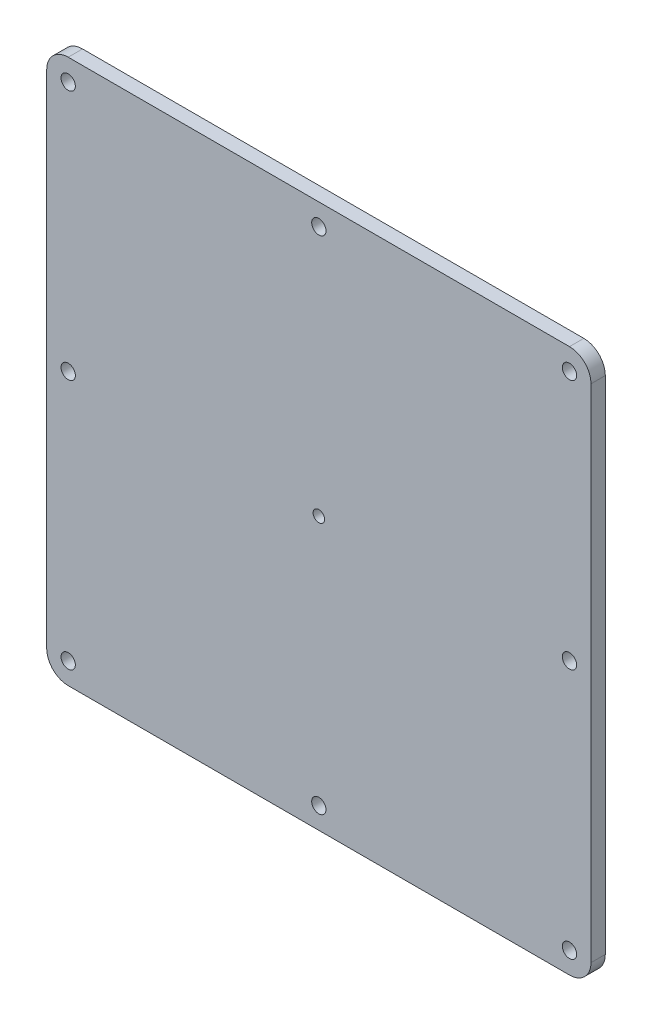
ISO-10303-21;
HEADER;
FILE_DESCRIPTION(('STEP AP214'),'2;1');
FILE_NAME('part.step','',(''),(''),'','','');
FILE_SCHEMA(('AUTOMOTIVE_DESIGN { 1 0 10303 214 1 1 1 1 }'));
ENDSEC;
DATA;
#1=APPLICATION_CONTEXT('core data for automotive mechanical design processes');
#2=APPLICATION_PROTOCOL_DEFINITION('international standard','automotive_design',2000,#1);
#3=PRODUCT_CONTEXT('',#1,'mechanical');
#4=PRODUCT('Part','Part','',(#3));
#5=PRODUCT_RELATED_PRODUCT_CATEGORY('part','',(#4));
#6=PRODUCT_DEFINITION_FORMATION('','',#4);
#7=PRODUCT_DEFINITION_CONTEXT('part definition',#1,'design');
#8=PRODUCT_DEFINITION('design','',#6,#7);
#9=PRODUCT_DEFINITION_SHAPE('','',#8);
#10=(LENGTH_UNIT() NAMED_UNIT(*) SI_UNIT(.MILLI.,.METRE.));
#11=(NAMED_UNIT(*) PLANE_ANGLE_UNIT() SI_UNIT($,.RADIAN.));
#12=(NAMED_UNIT(*) SI_UNIT($,.STERADIAN.) SOLID_ANGLE_UNIT());
#13=UNCERTAINTY_MEASURE_WITH_UNIT(LENGTH_MEASURE(1.E-05),#10,'distance_accuracy_value','');
#14=(GEOMETRIC_REPRESENTATION_CONTEXT(3) GLOBAL_UNCERTAINTY_ASSIGNED_CONTEXT((#13)) GLOBAL_UNIT_ASSIGNED_CONTEXT((#10,
#11,#12)) REPRESENTATION_CONTEXT('',''));
#15=CARTESIAN_POINT('',(0.,0.,0.));
#16=DIRECTION('',(0.,0.,1.));
#17=DIRECTION('',(1.,0.,0.));
#18=AXIS2_PLACEMENT_3D('',#15,#16,#17);
#19=CARTESIAN_POINT('',(-175.,-175.,10.));
#20=DIRECTION('',(0.,0.,1.));
#21=DIRECTION('',(1.,0.,0.));
#22=AXIS2_PLACEMENT_3D('',#19,#20,#21);
#23=PLANE('',#22);
#24=CARTESIAN_POINT('',(0.,-175.,10.));
#25=DIRECTION('',(0.,0.,1.));
#26=DIRECTION('',(1.,0.,0.));
#27=AXIS2_PLACEMENT_3D('',#24,#25,#26);
#28=CIRCLE('',#27,5.);
#29=CARTESIAN_POINT('',(5.,-175.,10.));
#30=VERTEX_POINT('',#29);
#31=EDGE_CURVE('E218',#30,#30,#28,.T.);
#32=ORIENTED_EDGE('',*,*,#31,.F.);
#33=EDGE_LOOP('',(#32));
#34=FACE_BOUND('',#33,.T.);
#35=CARTESIAN_POINT('',(0.,0.,10.));
#36=DIRECTION('',(0.,0.,1.));
#37=DIRECTION('',(1.,0.,0.));
#38=AXIS2_PLACEMENT_3D('',#35,#36,#37);
#39=CIRCLE('',#38,4.);
#40=CARTESIAN_POINT('',(3.99999999999997,0.,10.));
#41=VERTEX_POINT('',#40);
#42=EDGE_CURVE('E206',#41,#41,#39,.T.);
#43=ORIENTED_EDGE('',*,*,#42,.F.);
#44=EDGE_LOOP('',(#43));
#45=FACE_BOUND('',#44,.T.);
#46=CARTESIAN_POINT('',(175.,0.,10.));
#47=DIRECTION('',(0.,0.,1.));
#48=DIRECTION('',(1.,0.,0.));
#49=AXIS2_PLACEMENT_3D('',#46,#47,#48);
#50=CIRCLE('',#49,5.00000000000002);
#51=CARTESIAN_POINT('',(180.,0.,10.));
#52=VERTEX_POINT('',#51);
#53=EDGE_CURVE('E194',#52,#52,#50,.T.);
#54=ORIENTED_EDGE('',*,*,#53,.F.);
#55=EDGE_LOOP('',(#54));
#56=FACE_BOUND('',#55,.T.);
#57=CARTESIAN_POINT('',(0.,175.,10.));
#58=DIRECTION('',(0.,0.,1.));
#59=DIRECTION('',(1.,0.,0.));
#60=AXIS2_PLACEMENT_3D('',#57,#58,#59);
#61=CIRCLE('',#60,5.00000000000001);
#62=CARTESIAN_POINT('',(5.00000000000001,175.,10.));
#63=VERTEX_POINT('',#62);
#64=EDGE_CURVE('E182',#63,#63,#61,.T.);
#65=ORIENTED_EDGE('',*,*,#64,.F.);
#66=EDGE_LOOP('',(#65));
#67=FACE_BOUND('',#66,.T.);
#68=CARTESIAN_POINT('',(-175.,-175.,10.));
#69=DIRECTION('',(0.,0.,1.));
#70=DIRECTION('',(1.,0.,0.));
#71=AXIS2_PLACEMENT_3D('',#68,#69,#70);
#72=CIRCLE('',#71,15.);
#73=CARTESIAN_POINT('',(-190.,-175.,10.));
#74=VERTEX_POINT('',#73);
#75=CARTESIAN_POINT('',(-175.,-190.,10.));
#76=VERTEX_POINT('',#75);
#77=EDGE_CURVE('E145',#74,#76,#72,.T.);
#78=ORIENTED_EDGE('',*,*,#77,.T.);
#79=DIRECTION('',(1.,0.,0.));
#80=VECTOR('',#79,1.);
#81=CARTESIAN_POINT('',(-175.,-190.,10.));
#82=LINE('',#81,#80);
#83=CARTESIAN_POINT('',(175.,-190.,10.));
#84=VERTEX_POINT('',#83);
#85=EDGE_CURVE('E93',#76,#84,#82,.T.);
#86=ORIENTED_EDGE('',*,*,#85,.T.);
#87=CARTESIAN_POINT('',(175.,-175.,10.));
#88=DIRECTION('',(0.,0.,1.));
#89=DIRECTION('',(1.,0.,0.));
#90=AXIS2_PLACEMENT_3D('',#87,#88,#89);
#91=CIRCLE('',#90,15.);
#92=CARTESIAN_POINT('',(190.,-175.,10.));
#93=VERTEX_POINT('',#92);
#94=EDGE_CURVE('E160',#84,#93,#91,.T.);
#95=ORIENTED_EDGE('',*,*,#94,.T.);
#96=DIRECTION('',(0.,1.,0.));
#97=VECTOR('',#96,1.);
#98=CARTESIAN_POINT('',(190.,175.,10.));
#99=LINE('',#98,#97);
#100=CARTESIAN_POINT('',(190.,175.,10.));
#101=VERTEX_POINT('',#100);
#102=EDGE_CURVE('E173',#93,#101,#99,.T.);
#103=ORIENTED_EDGE('',*,*,#102,.T.);
#104=CARTESIAN_POINT('',(175.,175.,10.));
#105=DIRECTION('',(0.,0.,1.));
#106=DIRECTION('',(-1.,0.,0.));
#107=AXIS2_PLACEMENT_3D('',#104,#105,#106);
#108=CIRCLE('',#107,15.);
#109=CARTESIAN_POINT('',(175.,190.,10.));
#110=VERTEX_POINT('',#109);
#111=EDGE_CURVE('E112',#101,#110,#108,.T.);
#112=ORIENTED_EDGE('',*,*,#111,.T.);
#113=DIRECTION('',(-1.,0.,0.));
#114=VECTOR('',#113,1.);
#115=CARTESIAN_POINT('',(-175.,190.,10.));
#116=LINE('',#115,#114);
#117=CARTESIAN_POINT('',(-175.,190.,10.));
#118=VERTEX_POINT('',#117);
#119=EDGE_CURVE('E106',#110,#118,#116,.T.);
#120=ORIENTED_EDGE('',*,*,#119,.T.);
#121=CARTESIAN_POINT('',(-175.,175.,10.));
#122=DIRECTION('',(0.,0.,1.));
#123=DIRECTION('',(1.,0.,0.));
#124=AXIS2_PLACEMENT_3D('',#121,#122,#123);
#125=CIRCLE('',#124,15.0000000000001);
#126=CARTESIAN_POINT('',(-190.,175.,10.));
#127=VERTEX_POINT('',#126);
#128=EDGE_CURVE('E110',#118,#127,#125,.T.);
#129=ORIENTED_EDGE('',*,*,#128,.T.);
#130=DIRECTION('',(0.,-1.,0.));
#131=VECTOR('',#130,1.);
#132=CARTESIAN_POINT('',(-190.,175.,10.));
#133=LINE('',#132,#131);
#134=EDGE_CURVE('E50',#127,#74,#133,.T.);
#135=ORIENTED_EDGE('',*,*,#134,.T.);
#136=EDGE_LOOP('',(#78,#86,#95,#103,#112,#120,#129,#135));
#137=FACE_BOUND('',#136,.T.);
#138=CARTESIAN_POINT('',(-175.,175.,10.));
#139=DIRECTION('',(0.,0.,1.));
#140=DIRECTION('',(1.,0.,0.));
#141=AXIS2_PLACEMENT_3D('',#138,#139,#140);
#142=CIRCLE('',#141,4.99999999999999);
#143=CARTESIAN_POINT('',(-170.,175.,10.));
#144=VERTEX_POINT('',#143);
#145=EDGE_CURVE('E134',#144,#144,#142,.T.);
#146=ORIENTED_EDGE('',*,*,#145,.F.);
#147=EDGE_LOOP('',(#146));
#148=FACE_BOUND('',#147,.T.);
#149=CARTESIAN_POINT('',(175.,175.,10.));
#150=DIRECTION('',(0.,0.,1.));
#151=DIRECTION('',(1.,0.,0.));
#152=AXIS2_PLACEMENT_3D('',#149,#150,#151);
#153=CIRCLE('',#152,4.99999999999999);
#154=CARTESIAN_POINT('',(180.,175.,10.));
#155=VERTEX_POINT('',#154);
#156=EDGE_CURVE('E188',#155,#155,#153,.T.);
#157=ORIENTED_EDGE('',*,*,#156,.F.);
#158=EDGE_LOOP('',(#157));
#159=FACE_BOUND('',#158,.T.);
#160=CARTESIAN_POINT('',(-175.,0.,10.));
#161=DIRECTION('',(0.,0.,1.));
#162=DIRECTION('',(1.,0.,0.));
#163=AXIS2_PLACEMENT_3D('',#160,#161,#162);
#164=CIRCLE('',#163,5.00000000000002);
#165=CARTESIAN_POINT('',(-170.,0.,10.));
#166=VERTEX_POINT('',#165);
#167=EDGE_CURVE('E200',#166,#166,#164,.T.);
#168=ORIENTED_EDGE('',*,*,#167,.F.);
#169=EDGE_LOOP('',(#168));
#170=FACE_BOUND('',#169,.T.);
#171=CARTESIAN_POINT('',(-175.,-175.,10.));
#172=DIRECTION('',(0.,0.,1.));
#173=DIRECTION('',(1.,0.,0.));
#174=AXIS2_PLACEMENT_3D('',#171,#172,#173);
#175=CIRCLE('',#174,4.99999999999999);
#176=CARTESIAN_POINT('',(-170.,-175.,10.));
#177=VERTEX_POINT('',#176);
#178=EDGE_CURVE('E212',#177,#177,#175,.T.);
#179=ORIENTED_EDGE('',*,*,#178,.F.);
#180=EDGE_LOOP('',(#179));
#181=FACE_BOUND('',#180,.T.);
#182=CARTESIAN_POINT('',(175.,-175.,10.));
#183=DIRECTION('',(0.,0.,1.));
#184=DIRECTION('',(1.,0.,0.));
#185=AXIS2_PLACEMENT_3D('',#182,#183,#184);
#186=CIRCLE('',#185,4.99999999999999);
#187=CARTESIAN_POINT('',(180.,-175.,10.));
#188=VERTEX_POINT('',#187);
#189=EDGE_CURVE('E224',#188,#188,#186,.T.);
#190=ORIENTED_EDGE('',*,*,#189,.F.);
#191=EDGE_LOOP('',(#190));
#192=FACE_BOUND('',#191,.T.);
#193=ADVANCED_FACE('F33',(#34,#45,#56,#67,#137,#148,#159,#170,#181,#192),#23,.T.);
#194=CARTESIAN_POINT('',(-175.,-175.,0.));
#195=DIRECTION('',(0.,0.,1.));
#196=DIRECTION('',(1.,0.,0.));
#197=AXIS2_PLACEMENT_3D('',#194,#195,#196);
#198=PLANE('',#197);
#199=CARTESIAN_POINT('',(-175.,-175.,0.));
#200=DIRECTION('',(0.,0.,1.));
#201=DIRECTION('',(1.,0.,0.));
#202=AXIS2_PLACEMENT_3D('',#199,#200,#201);
#203=CIRCLE('',#202,15.);
#204=CARTESIAN_POINT('',(-190.,-175.,0.));
#205=VERTEX_POINT('',#204);
#206=CARTESIAN_POINT('',(-175.,-190.,0.));
#207=VERTEX_POINT('',#206);
#208=EDGE_CURVE('E130',#205,#207,#203,.T.);
#209=ORIENTED_EDGE('',*,*,#208,.F.);
#210=DIRECTION('',(0.,-1.,0.));
#211=VECTOR('',#210,1.);
#212=CARTESIAN_POINT('',(-190.,175.,0.));
#213=LINE('',#212,#211);
#214=CARTESIAN_POINT('',(-190.,175.,0.));
#215=VERTEX_POINT('',#214);
#216=EDGE_CURVE('E85',#215,#205,#213,.T.);
#217=ORIENTED_EDGE('',*,*,#216,.F.);
#218=CARTESIAN_POINT('',(-175.,175.,0.));
#219=DIRECTION('',(0.,0.,1.));
#220=DIRECTION('',(1.,0.,0.));
#221=AXIS2_PLACEMENT_3D('',#218,#219,#220);
#222=CIRCLE('',#221,15.0000000000001);
#223=CARTESIAN_POINT('',(-175.,190.,0.));
#224=VERTEX_POINT('',#223);
#225=EDGE_CURVE('E79',#224,#215,#222,.T.);
#226=ORIENTED_EDGE('',*,*,#225,.F.);
#227=DIRECTION('',(-1.,0.,0.));
#228=VECTOR('',#227,1.);
#229=CARTESIAN_POINT('',(-175.,190.,0.));
#230=LINE('',#229,#228);
#231=CARTESIAN_POINT('',(175.,190.,0.));
#232=VERTEX_POINT('',#231);
#233=EDGE_CURVE('E120',#232,#224,#230,.T.);
#234=ORIENTED_EDGE('',*,*,#233,.F.);
#235=CARTESIAN_POINT('',(175.,175.,0.));
#236=DIRECTION('',(0.,0.,1.));
#237=DIRECTION('',(-1.,0.,0.));
#238=AXIS2_PLACEMENT_3D('',#235,#236,#237);
#239=CIRCLE('',#238,15.);
#240=CARTESIAN_POINT('',(190.,175.,0.));
#241=VERTEX_POINT('',#240);
#242=EDGE_CURVE('E140',#241,#232,#239,.T.);
#243=ORIENTED_EDGE('',*,*,#242,.F.);
#244=DIRECTION('',(0.,1.,0.));
#245=VECTOR('',#244,1.);
#246=CARTESIAN_POINT('',(190.,175.,0.));
#247=LINE('',#246,#245);
#248=CARTESIAN_POINT('',(190.,-175.,0.));
#249=VERTEX_POINT('',#248);
#250=EDGE_CURVE('E138',#249,#241,#247,.T.);
#251=ORIENTED_EDGE('',*,*,#250,.F.);
#252=CARTESIAN_POINT('',(175.,-175.,0.));
#253=DIRECTION('',(0.,0.,1.));
#254=DIRECTION('',(1.,0.,0.));
#255=AXIS2_PLACEMENT_3D('',#252,#253,#254);
#256=CIRCLE('',#255,15.);
#257=CARTESIAN_POINT('',(175.,-190.,0.));
#258=VERTEX_POINT('',#257);
#259=EDGE_CURVE('E136',#258,#249,#256,.T.);
#260=ORIENTED_EDGE('',*,*,#259,.F.);
#261=DIRECTION('',(1.,0.,0.));
#262=VECTOR('',#261,1.);
#263=CARTESIAN_POINT('',(-175.,-190.,0.));
#264=LINE('',#263,#262);
#265=EDGE_CURVE('E133',#207,#258,#264,.T.);
#266=ORIENTED_EDGE('',*,*,#265,.F.);
#267=EDGE_LOOP('',(#209,#217,#226,#234,#243,#251,#260,#266));
#268=FACE_BOUND('',#267,.T.);
#269=CARTESIAN_POINT('',(-175.,175.,0.));
#270=DIRECTION('',(0.,0.,1.));
#271=DIRECTION('',(1.,0.,0.));
#272=AXIS2_PLACEMENT_3D('',#269,#270,#271);
#273=CIRCLE('',#272,4.99999999999999);
#274=CARTESIAN_POINT('',(-170.,175.,0.));
#275=VERTEX_POINT('',#274);
#276=EDGE_CURVE('E179',#275,#275,#273,.T.);
#277=ORIENTED_EDGE('',*,*,#276,.T.);
#278=EDGE_LOOP('',(#277));
#279=FACE_BOUND('',#278,.T.);
#280=CARTESIAN_POINT('',(0.,175.,0.));
#281=DIRECTION('',(0.,0.,1.));
#282=DIRECTION('',(1.,0.,0.));
#283=AXIS2_PLACEMENT_3D('',#280,#281,#282);
#284=CIRCLE('',#283,5.00000000000001);
#285=CARTESIAN_POINT('',(5.00000000000001,175.,0.));
#286=VERTEX_POINT('',#285);
#287=EDGE_CURVE('E185',#286,#286,#284,.T.);
#288=ORIENTED_EDGE('',*,*,#287,.T.);
#289=EDGE_LOOP('',(#288));
#290=FACE_BOUND('',#289,.T.);
#291=CARTESIAN_POINT('',(175.,175.,0.));
#292=DIRECTION('',(0.,0.,1.));
#293=DIRECTION('',(1.,0.,0.));
#294=AXIS2_PLACEMENT_3D('',#291,#292,#293);
#295=CIRCLE('',#294,4.99999999999999);
#296=CARTESIAN_POINT('',(180.,175.,0.));
#297=VERTEX_POINT('',#296);
#298=EDGE_CURVE('E191',#297,#297,#295,.T.);
#299=ORIENTED_EDGE('',*,*,#298,.T.);
#300=EDGE_LOOP('',(#299));
#301=FACE_BOUND('',#300,.T.);
#302=CARTESIAN_POINT('',(175.,0.,0.));
#303=DIRECTION('',(0.,0.,1.));
#304=DIRECTION('',(1.,0.,0.));
#305=AXIS2_PLACEMENT_3D('',#302,#303,#304);
#306=CIRCLE('',#305,5.00000000000002);
#307=CARTESIAN_POINT('',(180.,0.,0.));
#308=VERTEX_POINT('',#307);
#309=EDGE_CURVE('E197',#308,#308,#306,.T.);
#310=ORIENTED_EDGE('',*,*,#309,.T.);
#311=EDGE_LOOP('',(#310));
#312=FACE_BOUND('',#311,.T.);
#313=CARTESIAN_POINT('',(-175.,0.,0.));
#314=DIRECTION('',(0.,0.,1.));
#315=DIRECTION('',(1.,0.,0.));
#316=AXIS2_PLACEMENT_3D('',#313,#314,#315);
#317=CIRCLE('',#316,5.00000000000002);
#318=CARTESIAN_POINT('',(-170.,0.,0.));
#319=VERTEX_POINT('',#318);
#320=EDGE_CURVE('E203',#319,#319,#317,.T.);
#321=ORIENTED_EDGE('',*,*,#320,.T.);
#322=EDGE_LOOP('',(#321));
#323=FACE_BOUND('',#322,.T.);
#324=CARTESIAN_POINT('',(0.,0.,0.));
#325=DIRECTION('',(0.,0.,1.));
#326=DIRECTION('',(1.,0.,0.));
#327=AXIS2_PLACEMENT_3D('',#324,#325,#326);
#328=CIRCLE('',#327,4.);
#329=CARTESIAN_POINT('',(3.99999999999997,0.,0.));
#330=VERTEX_POINT('',#329);
#331=EDGE_CURVE('E209',#330,#330,#328,.T.);
#332=ORIENTED_EDGE('',*,*,#331,.T.);
#333=EDGE_LOOP('',(#332));
#334=FACE_BOUND('',#333,.T.);
#335=CARTESIAN_POINT('',(-175.,-175.,0.));
#336=DIRECTION('',(0.,0.,1.));
#337=DIRECTION('',(1.,0.,0.));
#338=AXIS2_PLACEMENT_3D('',#335,#336,#337);
#339=CIRCLE('',#338,4.99999999999999);
#340=CARTESIAN_POINT('',(-170.,-175.,0.));
#341=VERTEX_POINT('',#340);
#342=EDGE_CURVE('E215',#341,#341,#339,.T.);
#343=ORIENTED_EDGE('',*,*,#342,.T.);
#344=EDGE_LOOP('',(#343));
#345=FACE_BOUND('',#344,.T.);
#346=CARTESIAN_POINT('',(0.,-175.,0.));
#347=DIRECTION('',(0.,0.,1.));
#348=DIRECTION('',(1.,0.,0.));
#349=AXIS2_PLACEMENT_3D('',#346,#347,#348);
#350=CIRCLE('',#349,5.);
#351=CARTESIAN_POINT('',(5.,-175.,0.));
#352=VERTEX_POINT('',#351);
#353=EDGE_CURVE('E221',#352,#352,#350,.T.);
#354=ORIENTED_EDGE('',*,*,#353,.T.);
#355=EDGE_LOOP('',(#354));
#356=FACE_BOUND('',#355,.T.);
#357=CARTESIAN_POINT('',(175.,-175.,0.));
#358=DIRECTION('',(0.,0.,1.));
#359=DIRECTION('',(1.,0.,0.));
#360=AXIS2_PLACEMENT_3D('',#357,#358,#359);
#361=CIRCLE('',#360,4.99999999999999);
#362=CARTESIAN_POINT('',(180.,-175.,0.));
#363=VERTEX_POINT('',#362);
#364=EDGE_CURVE('E227',#363,#363,#361,.T.);
#365=ORIENTED_EDGE('',*,*,#364,.T.);
#366=EDGE_LOOP('',(#365));
#367=FACE_BOUND('',#366,.T.);
#368=ADVANCED_FACE('F164',(#268,#279,#290,#301,#312,#323,#334,#345,#356,#367),#198,.F.);
#369=CARTESIAN_POINT('',(-175.,-175.,10.));
#370=DIRECTION('',(0.,0.,-1.));
#371=DIRECTION('',(-1.,0.,0.));
#372=AXIS2_PLACEMENT_3D('',#369,#370,#371);
#373=CYLINDRICAL_SURFACE('',#372,15.);
#374=ORIENTED_EDGE('',*,*,#208,.T.);
#375=DIRECTION('',(0.,0.,-1.));
#376=VECTOR('',#375,1.);
#377=CARTESIAN_POINT('',(-175.,-190.,10.));
#378=LINE('',#377,#376);
#379=EDGE_CURVE('E11',#76,#207,#378,.T.);
#380=ORIENTED_EDGE('',*,*,#379,.F.);
#381=ORIENTED_EDGE('',*,*,#77,.F.);
#382=DIRECTION('',(0.,0.,-1.));
#383=VECTOR('',#382,1.);
#384=CARTESIAN_POINT('',(-190.,-175.,10.));
#385=LINE('',#384,#383);
#386=EDGE_CURVE('E126',#74,#205,#385,.T.);
#387=ORIENTED_EDGE('',*,*,#386,.T.);
#388=EDGE_LOOP('',(#374,#380,#381,#387));
#389=FACE_BOUND('',#388,.T.);
#390=ADVANCED_FACE('F35',(#389),#373,.T.);
#391=CARTESIAN_POINT('',(-175.,-190.,10.));
#392=DIRECTION('',(0.,1.,0.));
#393=DIRECTION('',(0.,0.,1.));
#394=AXIS2_PLACEMENT_3D('',#391,#392,#393);
#395=PLANE('',#394);
#396=ORIENTED_EDGE('',*,*,#265,.T.);
#397=DIRECTION('',(0.,0.,-1.));
#398=VECTOR('',#397,1.);
#399=CARTESIAN_POINT('',(175.,-190.,10.));
#400=LINE('',#399,#398);
#401=EDGE_CURVE('E42',#84,#258,#400,.T.);
#402=ORIENTED_EDGE('',*,*,#401,.F.);
#403=ORIENTED_EDGE('',*,*,#85,.F.);
#404=ORIENTED_EDGE('',*,*,#379,.T.);
#405=EDGE_LOOP('',(#396,#402,#403,#404));
#406=FACE_BOUND('',#405,.T.);
#407=ADVANCED_FACE('F261',(#406),#395,.F.);
#408=CARTESIAN_POINT('',(175.,-175.,10.));
#409=DIRECTION('',(0.,0.,-1.));
#410=DIRECTION('',(-1.,0.,0.));
#411=AXIS2_PLACEMENT_3D('',#408,#409,#410);
#412=CYLINDRICAL_SURFACE('',#411,15.);
#413=ORIENTED_EDGE('',*,*,#259,.T.);
#414=DIRECTION('',(0.,0.,-1.));
#415=VECTOR('',#414,1.);
#416=CARTESIAN_POINT('',(190.,-175.,10.));
#417=LINE('',#416,#415);
#418=EDGE_CURVE('E152',#93,#249,#417,.T.);
#419=ORIENTED_EDGE('',*,*,#418,.F.);
#420=ORIENTED_EDGE('',*,*,#94,.F.);
#421=ORIENTED_EDGE('',*,*,#401,.T.);
#422=EDGE_LOOP('',(#413,#419,#420,#421));
#423=FACE_BOUND('',#422,.T.);
#424=ADVANCED_FACE('F158',(#423),#412,.T.);
#425=CARTESIAN_POINT('',(190.,175.,10.));
#426=DIRECTION('',(-1.,0.,0.));
#427=DIRECTION('',(0.,-1.,0.));
#428=AXIS2_PLACEMENT_3D('',#425,#426,#427);
#429=PLANE('',#428);
#430=ORIENTED_EDGE('',*,*,#250,.T.);
#431=DIRECTION('',(0.,0.,-1.));
#432=VECTOR('',#431,1.);
#433=CARTESIAN_POINT('',(190.,175.,10.));
#434=LINE('',#433,#432);
#435=EDGE_CURVE('E149',#101,#241,#434,.T.);
#436=ORIENTED_EDGE('',*,*,#435,.F.);
#437=ORIENTED_EDGE('',*,*,#102,.F.);
#438=ORIENTED_EDGE('',*,*,#418,.T.);
#439=EDGE_LOOP('',(#430,#436,#437,#438));
#440=FACE_BOUND('',#439,.T.);
#441=ADVANCED_FACE('F169',(#440),#429,.F.);
#442=CARTESIAN_POINT('',(175.,175.,10.));
#443=DIRECTION('',(0.,0.,-1.));
#444=DIRECTION('',(-1.,0.,0.));
#445=AXIS2_PLACEMENT_3D('',#442,#443,#444);
#446=CYLINDRICAL_SURFACE('',#445,15.);
#447=ORIENTED_EDGE('',*,*,#242,.T.);
#448=DIRECTION('',(0.,0.,-1.));
#449=VECTOR('',#448,1.);
#450=CARTESIAN_POINT('',(175.,190.,10.));
#451=LINE('',#450,#449);
#452=EDGE_CURVE('E121',#110,#232,#451,.T.);
#453=ORIENTED_EDGE('',*,*,#452,.F.);
#454=ORIENTED_EDGE('',*,*,#111,.F.);
#455=ORIENTED_EDGE('',*,*,#435,.T.);
#456=EDGE_LOOP('',(#447,#453,#454,#455));
#457=FACE_BOUND('',#456,.T.);
#458=ADVANCED_FACE('F172',(#457),#446,.T.);
#459=CARTESIAN_POINT('',(-175.,190.,10.));
#460=DIRECTION('',(0.,-1.,0.));
#461=DIRECTION('',(0.,0.,-1.));
#462=AXIS2_PLACEMENT_3D('',#459,#460,#461);
#463=PLANE('',#462);
#464=ORIENTED_EDGE('',*,*,#233,.T.);
#465=DIRECTION('',(0.,0.,-1.));
#466=VECTOR('',#465,1.);
#467=CARTESIAN_POINT('',(-175.,190.,10.));
#468=LINE('',#467,#466);
#469=EDGE_CURVE('E117',#118,#224,#468,.T.);
#470=ORIENTED_EDGE('',*,*,#469,.F.);
#471=ORIENTED_EDGE('',*,*,#119,.F.);
#472=ORIENTED_EDGE('',*,*,#452,.T.);
#473=EDGE_LOOP('',(#464,#470,#471,#472));
#474=FACE_BOUND('',#473,.T.);
#475=ADVANCED_FACE('F118',(#474),#463,.F.);
#476=CARTESIAN_POINT('',(-175.,175.,10.));
#477=DIRECTION('',(0.,0.,-1.));
#478=DIRECTION('',(-1.,0.,0.));
#479=AXIS2_PLACEMENT_3D('',#476,#477,#478);
#480=CYLINDRICAL_SURFACE('',#479,15.0000000000001);
#481=ORIENTED_EDGE('',*,*,#225,.T.);
#482=DIRECTION('',(0.,0.,-1.));
#483=VECTOR('',#482,1.);
#484=CARTESIAN_POINT('',(-190.,175.,10.));
#485=LINE('',#484,#483);
#486=EDGE_CURVE('E122',#127,#215,#485,.T.);
#487=ORIENTED_EDGE('',*,*,#486,.F.);
#488=ORIENTED_EDGE('',*,*,#128,.F.);
#489=ORIENTED_EDGE('',*,*,#469,.T.);
#490=EDGE_LOOP('',(#481,#487,#488,#489));
#491=FACE_BOUND('',#490,.T.);
#492=ADVANCED_FACE('F124',(#491),#480,.T.);
#493=CARTESIAN_POINT('',(-190.,175.,10.));
#494=DIRECTION('',(1.,0.,0.));
#495=DIRECTION('',(0.,1.,0.));
#496=AXIS2_PLACEMENT_3D('',#493,#494,#495);
#497=PLANE('',#496);
#498=ORIENTED_EDGE('',*,*,#216,.T.);
#499=ORIENTED_EDGE('',*,*,#386,.F.);
#500=ORIENTED_EDGE('',*,*,#134,.F.);
#501=ORIENTED_EDGE('',*,*,#486,.T.);
#502=EDGE_LOOP('',(#498,#499,#500,#501));
#503=FACE_BOUND('',#502,.T.);
#504=ADVANCED_FACE('F249',(#503),#497,.F.);
#505=CARTESIAN_POINT('',(-175.,175.,10.));
#506=DIRECTION('',(0.,0.,-1.));
#507=DIRECTION('',(-1.,0.,0.));
#508=AXIS2_PLACEMENT_3D('',#505,#506,#507);
#509=CYLINDRICAL_SURFACE('',#508,4.99999999999999);
#510=ORIENTED_EDGE('',*,*,#145,.T.);
#511=EDGE_LOOP('',(#510));
#512=FACE_BOUND('',#511,.T.);
#513=ORIENTED_EDGE('',*,*,#276,.F.);
#514=EDGE_LOOP('',(#513));
#515=FACE_BOUND('',#514,.T.);
#516=ADVANCED_FACE('F246',(#512,#515),#509,.F.);
#517=CARTESIAN_POINT('',(0.,175.,10.));
#518=DIRECTION('',(0.,0.,-1.));
#519=DIRECTION('',(-1.,0.,0.));
#520=AXIS2_PLACEMENT_3D('',#517,#518,#519);
#521=CYLINDRICAL_SURFACE('',#520,5.00000000000001);
#522=ORIENTED_EDGE('',*,*,#64,.T.);
#523=EDGE_LOOP('',(#522));
#524=FACE_BOUND('',#523,.T.);
#525=ORIENTED_EDGE('',*,*,#287,.F.);
#526=EDGE_LOOP('',(#525));
#527=FACE_BOUND('',#526,.T.);
#528=ADVANCED_FACE('F325',(#524,#527),#521,.F.);
#529=CARTESIAN_POINT('',(175.,175.,10.));
#530=DIRECTION('',(0.,0.,-1.));
#531=DIRECTION('',(-1.,0.,0.));
#532=AXIS2_PLACEMENT_3D('',#529,#530,#531);
#533=CYLINDRICAL_SURFACE('',#532,4.99999999999999);
#534=ORIENTED_EDGE('',*,*,#156,.T.);
#535=EDGE_LOOP('',(#534));
#536=FACE_BOUND('',#535,.T.);
#537=ORIENTED_EDGE('',*,*,#298,.F.);
#538=EDGE_LOOP('',(#537));
#539=FACE_BOUND('',#538,.T.);
#540=ADVANCED_FACE('F333',(#536,#539),#533,.F.);
#541=CARTESIAN_POINT('',(175.,0.,10.));
#542=DIRECTION('',(0.,0.,-1.));
#543=DIRECTION('',(-1.,0.,0.));
#544=AXIS2_PLACEMENT_3D('',#541,#542,#543);
#545=CYLINDRICAL_SURFACE('',#544,5.00000000000002);
#546=ORIENTED_EDGE('',*,*,#53,.T.);
#547=EDGE_LOOP('',(#546));
#548=FACE_BOUND('',#547,.T.);
#549=ORIENTED_EDGE('',*,*,#309,.F.);
#550=EDGE_LOOP('',(#549));
#551=FACE_BOUND('',#550,.T.);
#552=ADVANCED_FACE('F341',(#548,#551),#545,.F.);
#553=CARTESIAN_POINT('',(-175.,0.,10.));
#554=DIRECTION('',(0.,0.,-1.));
#555=DIRECTION('',(-1.,0.,0.));
#556=AXIS2_PLACEMENT_3D('',#553,#554,#555);
#557=CYLINDRICAL_SURFACE('',#556,5.00000000000002);
#558=ORIENTED_EDGE('',*,*,#167,.T.);
#559=EDGE_LOOP('',(#558));
#560=FACE_BOUND('',#559,.T.);
#561=ORIENTED_EDGE('',*,*,#320,.F.);
#562=EDGE_LOOP('',(#561));
#563=FACE_BOUND('',#562,.T.);
#564=ADVANCED_FACE('F350',(#560,#563),#557,.F.);
#565=CARTESIAN_POINT('',(0.,0.,10.));
#566=DIRECTION('',(0.,0.,-1.));
#567=DIRECTION('',(-1.,0.,0.));
#568=AXIS2_PLACEMENT_3D('',#565,#566,#567);
#569=CYLINDRICAL_SURFACE('',#568,4.);
#570=ORIENTED_EDGE('',*,*,#42,.T.);
#571=EDGE_LOOP('',(#570));
#572=FACE_BOUND('',#571,.T.);
#573=ORIENTED_EDGE('',*,*,#331,.F.);
#574=EDGE_LOOP('',(#573));
#575=FACE_BOUND('',#574,.T.);
#576=ADVANCED_FACE('F359',(#572,#575),#569,.F.);
#577=CARTESIAN_POINT('',(-175.,-175.,10.));
#578=DIRECTION('',(0.,0.,-1.));
#579=DIRECTION('',(-1.,0.,0.));
#580=AXIS2_PLACEMENT_3D('',#577,#578,#579);
#581=CYLINDRICAL_SURFACE('',#580,4.99999999999999);
#582=ORIENTED_EDGE('',*,*,#178,.T.);
#583=EDGE_LOOP('',(#582));
#584=FACE_BOUND('',#583,.T.);
#585=ORIENTED_EDGE('',*,*,#342,.F.);
#586=EDGE_LOOP('',(#585));
#587=FACE_BOUND('',#586,.T.);
#588=ADVANCED_FACE('F368',(#584,#587),#581,.F.);
#589=CARTESIAN_POINT('',(0.,-175.,10.));
#590=DIRECTION('',(0.,0.,-1.));
#591=DIRECTION('',(-1.,0.,0.));
#592=AXIS2_PLACEMENT_3D('',#589,#590,#591);
#593=CYLINDRICAL_SURFACE('',#592,5.);
#594=ORIENTED_EDGE('',*,*,#31,.T.);
#595=EDGE_LOOP('',(#594));
#596=FACE_BOUND('',#595,.T.);
#597=ORIENTED_EDGE('',*,*,#353,.F.);
#598=EDGE_LOOP('',(#597));
#599=FACE_BOUND('',#598,.T.);
#600=ADVANCED_FACE('F377',(#596,#599),#593,.F.);
#601=CARTESIAN_POINT('',(175.,-175.,10.));
#602=DIRECTION('',(0.,0.,-1.));
#603=DIRECTION('',(-1.,0.,0.));
#604=AXIS2_PLACEMENT_3D('',#601,#602,#603);
#605=CYLINDRICAL_SURFACE('',#604,4.99999999999999);
#606=ORIENTED_EDGE('',*,*,#189,.T.);
#607=EDGE_LOOP('',(#606));
#608=FACE_BOUND('',#607,.T.);
#609=ORIENTED_EDGE('',*,*,#364,.F.);
#610=EDGE_LOOP('',(#609));
#611=FACE_BOUND('',#610,.T.);
#612=ADVANCED_FACE('F233',(#608,#611),#605,.F.);
#613=CLOSED_SHELL('',(#193,#368,#390,#407,#424,#441,#458,#475,#492,#504,#516,#528,#540,#552,
#564,#576,#588,#600,#612));
#614=MANIFOLD_SOLID_BREP('B2',#613);
#615=ADVANCED_BREP_SHAPE_REPRESENTATION('',(#18,#614),#14);
#616=SHAPE_DEFINITION_REPRESENTATION(#9,#615);
ENDSEC;
END-ISO-10303-21;
